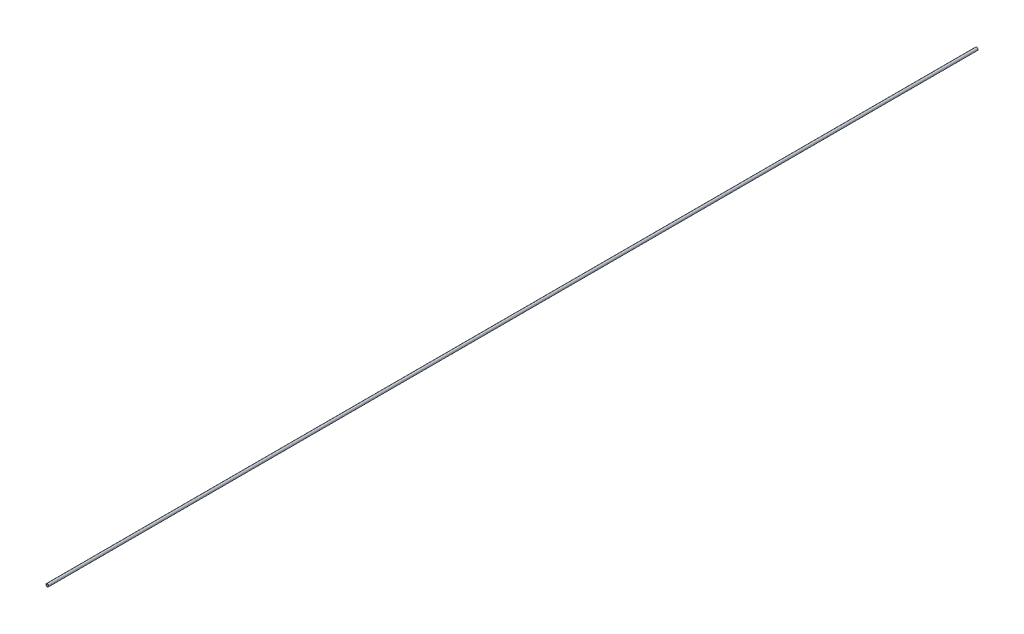
ISO-10303-21;
HEADER;
FILE_DESCRIPTION(('STEP AP214'),'2;1');
FILE_NAME('part.step','',(''),(''),'','','');
FILE_SCHEMA(('AUTOMOTIVE_DESIGN { 1 0 10303 214 1 1 1 1 }'));
ENDSEC;
DATA;
#1=APPLICATION_CONTEXT('core data for automotive mechanical design processes');
#2=APPLICATION_PROTOCOL_DEFINITION('international standard','automotive_design',2000,#1);
#3=PRODUCT_CONTEXT('',#1,'mechanical');
#4=PRODUCT('Part','Part','',(#3));
#5=PRODUCT_RELATED_PRODUCT_CATEGORY('part','',(#4));
#6=PRODUCT_DEFINITION_FORMATION('','',#4);
#7=PRODUCT_DEFINITION_CONTEXT('part definition',#1,'design');
#8=PRODUCT_DEFINITION('design','',#6,#7);
#9=PRODUCT_DEFINITION_SHAPE('','',#8);
#10=(LENGTH_UNIT() NAMED_UNIT(*) SI_UNIT(.MILLI.,.METRE.));
#11=(NAMED_UNIT(*) PLANE_ANGLE_UNIT() SI_UNIT($,.RADIAN.));
#12=(NAMED_UNIT(*) SI_UNIT($,.STERADIAN.) SOLID_ANGLE_UNIT());
#13=UNCERTAINTY_MEASURE_WITH_UNIT(LENGTH_MEASURE(1.E-05),#10,'distance_accuracy_value','');
#14=(GEOMETRIC_REPRESENTATION_CONTEXT(3) GLOBAL_UNCERTAINTY_ASSIGNED_CONTEXT((#13)) GLOBAL_UNIT_ASSIGNED_CONTEXT((#10,
#11,#12)) REPRESENTATION_CONTEXT('',''));
#15=CARTESIAN_POINT('',(0.,0.,0.));
#16=DIRECTION('',(0.,0.,1.));
#17=DIRECTION('',(1.,0.,0.));
#18=AXIS2_PLACEMENT_3D('',#15,#16,#17);
#19=CARTESIAN_POINT('',(0.,0.,502.5));
#20=DIRECTION('',(0.,0.,1.));
#21=DIRECTION('',(1.,0.,0.));
#22=AXIS2_PLACEMENT_3D('',#19,#20,#21);
#23=PLANE('',#22);
#24=CARTESIAN_POINT('',(0.,0.,502.5));
#25=DIRECTION('',(0.,0.,1.));
#26=DIRECTION('',(1.,0.,0.));
#27=AXIS2_PLACEMENT_3D('',#24,#25,#26);
#28=CIRCLE('',#27,1.5);
#29=CARTESIAN_POINT('',(1.5,0.,502.5));
#30=VERTEX_POINT('',#29);
#31=EDGE_CURVE('E10',#30,#30,#28,.T.);
#32=ORIENTED_EDGE('',*,*,#31,.T.);
#33=EDGE_LOOP('',(#32));
#34=FACE_BOUND('',#33,.T.);
#35=CARTESIAN_POINT('',(0.,0.,502.5));
#36=DIRECTION('',(0.,0.,1.));
#37=DIRECTION('',(1.,0.,0.));
#38=AXIS2_PLACEMENT_3D('',#35,#36,#37);
#39=CIRCLE('',#38,1.);
#40=CARTESIAN_POINT('',(1.,0.,502.5));
#41=VERTEX_POINT('',#40);
#42=EDGE_CURVE('E41',#41,#41,#39,.T.);
#43=ORIENTED_EDGE('',*,*,#42,.F.);
#44=EDGE_LOOP('',(#43));
#45=FACE_BOUND('',#44,.T.);
#46=ADVANCED_FACE('F30',(#34,#45),#23,.T.);
#47=CARTESIAN_POINT('',(0.,0.,-502.5));
#48=DIRECTION('',(0.,0.,1.));
#49=DIRECTION('',(1.,0.,0.));
#50=AXIS2_PLACEMENT_3D('',#47,#48,#49);
#51=PLANE('',#50);
#52=CARTESIAN_POINT('',(0.,0.,-502.5));
#53=DIRECTION('',(0.,0.,1.));
#54=DIRECTION('',(1.,0.,0.));
#55=AXIS2_PLACEMENT_3D('',#52,#53,#54);
#56=CIRCLE('',#55,1.5);
#57=CARTESIAN_POINT('',(1.5,0.,-502.5));
#58=VERTEX_POINT('',#57);
#59=EDGE_CURVE('E34',#58,#58,#56,.T.);
#60=ORIENTED_EDGE('',*,*,#59,.F.);
#61=EDGE_LOOP('',(#60));
#62=FACE_BOUND('',#61,.T.);
#63=CARTESIAN_POINT('',(0.,0.,-502.5));
#64=DIRECTION('',(0.,0.,1.));
#65=DIRECTION('',(1.,0.,0.));
#66=AXIS2_PLACEMENT_3D('',#63,#64,#65);
#67=CIRCLE('',#66,1.);
#68=CARTESIAN_POINT('',(1.,0.,-502.5));
#69=VERTEX_POINT('',#68);
#70=EDGE_CURVE('E43',#69,#69,#67,.T.);
#71=ORIENTED_EDGE('',*,*,#70,.T.);
#72=EDGE_LOOP('',(#71));
#73=FACE_BOUND('',#72,.T.);
#74=ADVANCED_FACE('F53',(#62,#73),#51,.F.);
#75=CARTESIAN_POINT('',(0.,0.,502.5));
#76=DIRECTION('',(0.,0.,-1.));
#77=DIRECTION('',(-1.,0.,0.));
#78=AXIS2_PLACEMENT_3D('',#75,#76,#77);
#79=CYLINDRICAL_SURFACE('',#78,1.5);
#80=ORIENTED_EDGE('',*,*,#31,.F.);
#81=EDGE_LOOP('',(#80));
#82=FACE_BOUND('',#81,.T.);
#83=ORIENTED_EDGE('',*,*,#59,.T.);
#84=EDGE_LOOP('',(#83));
#85=FACE_BOUND('',#84,.T.);
#86=ADVANCED_FACE('F32',(#82,#85),#79,.T.);
#87=CARTESIAN_POINT('',(0.,0.,502.5));
#88=DIRECTION('',(0.,0.,-1.));
#89=DIRECTION('',(-1.,0.,0.));
#90=AXIS2_PLACEMENT_3D('',#87,#88,#89);
#91=CYLINDRICAL_SURFACE('',#90,1.);
#92=ORIENTED_EDGE('',*,*,#42,.T.);
#93=EDGE_LOOP('',(#92));
#94=FACE_BOUND('',#93,.T.);
#95=ORIENTED_EDGE('',*,*,#70,.F.);
#96=EDGE_LOOP('',(#95));
#97=FACE_BOUND('',#96,.T.);
#98=ADVANCED_FACE('F49',(#94,#97),#91,.F.);
#99=CLOSED_SHELL('',(#46,#74,#86,#98));
#100=MANIFOLD_SOLID_BREP('B2',#99);
#101=ADVANCED_BREP_SHAPE_REPRESENTATION('',(#18,#100),#14);
#102=SHAPE_DEFINITION_REPRESENTATION(#9,#101);
ENDSEC;
END-ISO-10303-21;
